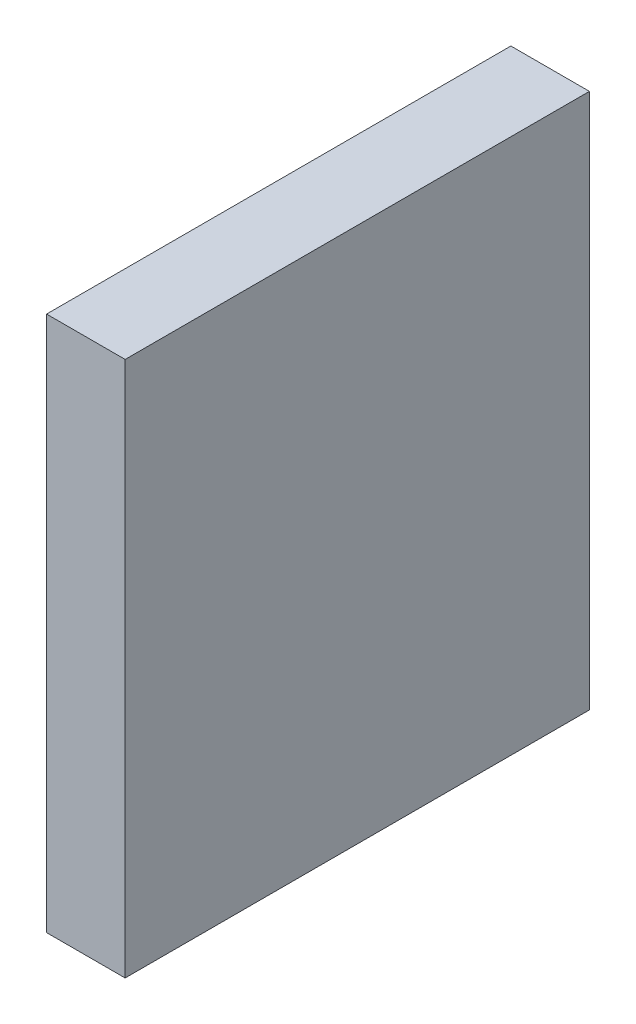
ISO-10303-21;
HEADER;
FILE_DESCRIPTION(('STEP AP214'),'2;1');
FILE_NAME('part.step','',(''),(''),'','','');
FILE_SCHEMA(('AUTOMOTIVE_DESIGN { 1 0 10303 214 1 1 1 1 }'));
ENDSEC;
DATA;
#1=APPLICATION_CONTEXT('core data for automotive mechanical design processes');
#2=APPLICATION_PROTOCOL_DEFINITION('international standard','automotive_design',2000,#1);
#3=PRODUCT_CONTEXT('',#1,'mechanical');
#4=PRODUCT('Part','Part','',(#3));
#5=PRODUCT_RELATED_PRODUCT_CATEGORY('part','',(#4));
#6=PRODUCT_DEFINITION_FORMATION('','',#4);
#7=PRODUCT_DEFINITION_CONTEXT('part definition',#1,'design');
#8=PRODUCT_DEFINITION('design','',#6,#7);
#9=PRODUCT_DEFINITION_SHAPE('','',#8);
#10=(LENGTH_UNIT() NAMED_UNIT(*) SI_UNIT(.MILLI.,.METRE.));
#11=(NAMED_UNIT(*) PLANE_ANGLE_UNIT() SI_UNIT($,.RADIAN.));
#12=(NAMED_UNIT(*) SI_UNIT($,.STERADIAN.) SOLID_ANGLE_UNIT());
#13=UNCERTAINTY_MEASURE_WITH_UNIT(LENGTH_MEASURE(1.E-05),#10,'distance_accuracy_value','');
#14=(GEOMETRIC_REPRESENTATION_CONTEXT(3) GLOBAL_UNCERTAINTY_ASSIGNED_CONTEXT((#13)) GLOBAL_UNIT_ASSIGNED_CONTEXT((#10,
#11,#12)) REPRESENTATION_CONTEXT('',''));
#15=CARTESIAN_POINT('',(0.,0.,0.));
#16=DIRECTION('',(0.,0.,1.));
#17=DIRECTION('',(1.,0.,0.));
#18=AXIS2_PLACEMENT_3D('',#15,#16,#17);
#19=CARTESIAN_POINT('',(0.,75.,-187.));
#20=DIRECTION('',(1.,0.,0.));
#21=DIRECTION('',(0.,0.,-1.));
#22=AXIS2_PLACEMENT_3D('',#19,#20,#21);
#23=PLANE('',#22);
#24=DIRECTION('',(0.,0.,1.));
#25=VECTOR('',#24,1.);
#26=CARTESIAN_POINT('',(0.,150.,-252.));
#27=LINE('',#26,#25);
#28=CARTESIAN_POINT('',(0.,150.,-252.));
#29=VERTEX_POINT('',#28);
#30=CARTESIAN_POINT('',(0.,150.,-122.));
#31=VERTEX_POINT('',#30);
#32=EDGE_CURVE('E78',#29,#31,#27,.T.);
#33=ORIENTED_EDGE('',*,*,#32,.F.);
#34=DIRECTION('',(0.,1.,0.));
#35=VECTOR('',#34,1.);
#36=CARTESIAN_POINT('',(0.,0.,-252.));
#37=LINE('',#36,#35);
#38=CARTESIAN_POINT('',(0.,0.,-252.));
#39=VERTEX_POINT('',#38);
#40=EDGE_CURVE('E54',#39,#29,#37,.T.);
#41=ORIENTED_EDGE('',*,*,#40,.F.);
#42=DIRECTION('',(0.,0.,-1.));
#43=VECTOR('',#42,1.);
#44=CARTESIAN_POINT('',(0.,0.,-122.));
#45=LINE('',#44,#43);
#46=CARTESIAN_POINT('',(0.,0.,-122.));
#47=VERTEX_POINT('',#46);
#48=EDGE_CURVE('E56',#47,#39,#45,.T.);
#49=ORIENTED_EDGE('',*,*,#48,.F.);
#50=DIRECTION('',(0.,-1.,0.));
#51=VECTOR('',#50,1.);
#52=CARTESIAN_POINT('',(0.,150.,-122.));
#53=LINE('',#52,#51);
#54=EDGE_CURVE('E19',#31,#47,#53,.T.);
#55=ORIENTED_EDGE('',*,*,#54,.F.);
#56=EDGE_LOOP('',(#33,#41,#49,#55));
#57=FACE_BOUND('',#56,.T.);
#58=ADVANCED_FACE('F16',(#57),#23,.F.);
#59=CARTESIAN_POINT('',(0.,150.,-122.));
#60=DIRECTION('',(0.,0.,1.));
#61=DIRECTION('',(0.,-1.,0.));
#62=AXIS2_PLACEMENT_3D('',#59,#60,#61);
#63=PLANE('',#62);
#64=DIRECTION('',(0.,1.,0.));
#65=VECTOR('',#64,1.);
#66=CARTESIAN_POINT('',(22.,75.,-122.));
#67=LINE('',#66,#65);
#68=CARTESIAN_POINT('',(22.,150.,-122.));
#69=VERTEX_POINT('',#68);
#70=CARTESIAN_POINT('',(22.,0.,-122.));
#71=VERTEX_POINT('',#70);
#72=EDGE_CURVE('E82',#69,#71,#67,.F.);
#73=ORIENTED_EDGE('',*,*,#72,.F.);
#74=DIRECTION('',(1.,0.,0.));
#75=VECTOR('',#74,1.);
#76=CARTESIAN_POINT('',(0.,150.,-122.));
#77=LINE('',#76,#75);
#78=EDGE_CURVE('E67',#31,#69,#77,.T.);
#79=ORIENTED_EDGE('',*,*,#78,.F.);
#80=ORIENTED_EDGE('',*,*,#54,.T.);
#81=DIRECTION('',(1.,0.,0.));
#82=VECTOR('',#81,1.);
#83=CARTESIAN_POINT('',(0.,0.,-122.));
#84=LINE('',#83,#82);
#85=EDGE_CURVE('E62',#71,#47,#84,.F.);
#86=ORIENTED_EDGE('',*,*,#85,.F.);
#87=EDGE_LOOP('',(#73,#79,#80,#86));
#88=FACE_BOUND('',#87,.T.);
#89=ADVANCED_FACE('F64',(#88),#63,.T.);
#90=CARTESIAN_POINT('',(0.,0.,-122.));
#91=DIRECTION('',(0.,-1.,0.));
#92=DIRECTION('',(0.,0.,-1.));
#93=AXIS2_PLACEMENT_3D('',#90,#91,#92);
#94=PLANE('',#93);
#95=DIRECTION('',(0.,0.,-1.));
#96=VECTOR('',#95,1.);
#97=CARTESIAN_POINT('',(22.,0.,-187.));
#98=LINE('',#97,#96);
#99=CARTESIAN_POINT('',(22.,0.,-252.));
#100=VERTEX_POINT('',#99);
#101=EDGE_CURVE('E71',#71,#100,#98,.T.);
#102=ORIENTED_EDGE('',*,*,#101,.F.);
#103=ORIENTED_EDGE('',*,*,#85,.T.);
#104=ORIENTED_EDGE('',*,*,#48,.T.);
#105=DIRECTION('',(-1.,0.,0.));
#106=VECTOR('',#105,1.);
#107=CARTESIAN_POINT('',(0.,0.,-252.));
#108=LINE('',#107,#106);
#109=EDGE_CURVE('E74',#100,#39,#108,.T.);
#110=ORIENTED_EDGE('',*,*,#109,.F.);
#111=EDGE_LOOP('',(#102,#103,#104,#110));
#112=FACE_BOUND('',#111,.T.);
#113=ADVANCED_FACE('F69',(#112),#94,.T.);
#114=CARTESIAN_POINT('',(0.,0.,-252.));
#115=DIRECTION('',(0.,0.,-1.));
#116=DIRECTION('',(-1.,0.,0.));
#117=AXIS2_PLACEMENT_3D('',#114,#115,#116);
#118=PLANE('',#117);
#119=DIRECTION('',(0.,1.,0.));
#120=VECTOR('',#119,1.);
#121=CARTESIAN_POINT('',(22.,75.,-252.));
#122=LINE('',#121,#120);
#123=CARTESIAN_POINT('',(22.,150.,-252.));
#124=VERTEX_POINT('',#123);
#125=EDGE_CURVE('E25',#100,#124,#122,.T.);
#126=ORIENTED_EDGE('',*,*,#125,.F.);
#127=ORIENTED_EDGE('',*,*,#109,.T.);
#128=ORIENTED_EDGE('',*,*,#40,.T.);
#129=DIRECTION('',(1.,0.,0.));
#130=VECTOR('',#129,1.);
#131=CARTESIAN_POINT('',(0.,150.,-252.));
#132=LINE('',#131,#130);
#133=EDGE_CURVE('E34',#124,#29,#132,.F.);
#134=ORIENTED_EDGE('',*,*,#133,.F.);
#135=EDGE_LOOP('',(#126,#127,#128,#134));
#136=FACE_BOUND('',#135,.T.);
#137=ADVANCED_FACE('F88',(#136),#118,.T.);
#138=CARTESIAN_POINT('',(0.,150.,-252.));
#139=DIRECTION('',(0.,1.,0.));
#140=DIRECTION('',(0.,0.,1.));
#141=AXIS2_PLACEMENT_3D('',#138,#139,#140);
#142=PLANE('',#141);
#143=DIRECTION('',(0.,0.,-1.));
#144=VECTOR('',#143,1.);
#145=CARTESIAN_POINT('',(22.,150.,-187.));
#146=LINE('',#145,#144);
#147=EDGE_CURVE('E11',#124,#69,#146,.F.);
#148=ORIENTED_EDGE('',*,*,#147,.F.);
#149=ORIENTED_EDGE('',*,*,#133,.T.);
#150=ORIENTED_EDGE('',*,*,#32,.T.);
#151=ORIENTED_EDGE('',*,*,#78,.T.);
#152=EDGE_LOOP('',(#148,#149,#150,#151));
#153=FACE_BOUND('',#152,.T.);
#154=ADVANCED_FACE('F90',(#153),#142,.T.);
#155=CARTESIAN_POINT('',(22.,75.,-187.));
#156=DIRECTION('',(1.,0.,0.));
#157=DIRECTION('',(0.,0.,-1.));
#158=AXIS2_PLACEMENT_3D('',#155,#156,#157);
#159=PLANE('',#158);
#160=ORIENTED_EDGE('',*,*,#125,.T.);
#161=ORIENTED_EDGE('',*,*,#147,.T.);
#162=ORIENTED_EDGE('',*,*,#72,.T.);
#163=ORIENTED_EDGE('',*,*,#101,.T.);
#164=EDGE_LOOP('',(#160,#161,#162,#163));
#165=FACE_BOUND('',#164,.T.);
#166=ADVANCED_FACE('F87',(#165),#159,.T.);
#167=CLOSED_SHELL('',(#58,#89,#113,#137,#154,#166));
#168=MANIFOLD_SOLID_BREP('B1',#167);
#169=ADVANCED_BREP_SHAPE_REPRESENTATION('',(#18,#168),#14);
#170=SHAPE_DEFINITION_REPRESENTATION(#9,#169);
ENDSEC;
END-ISO-10303-21;
